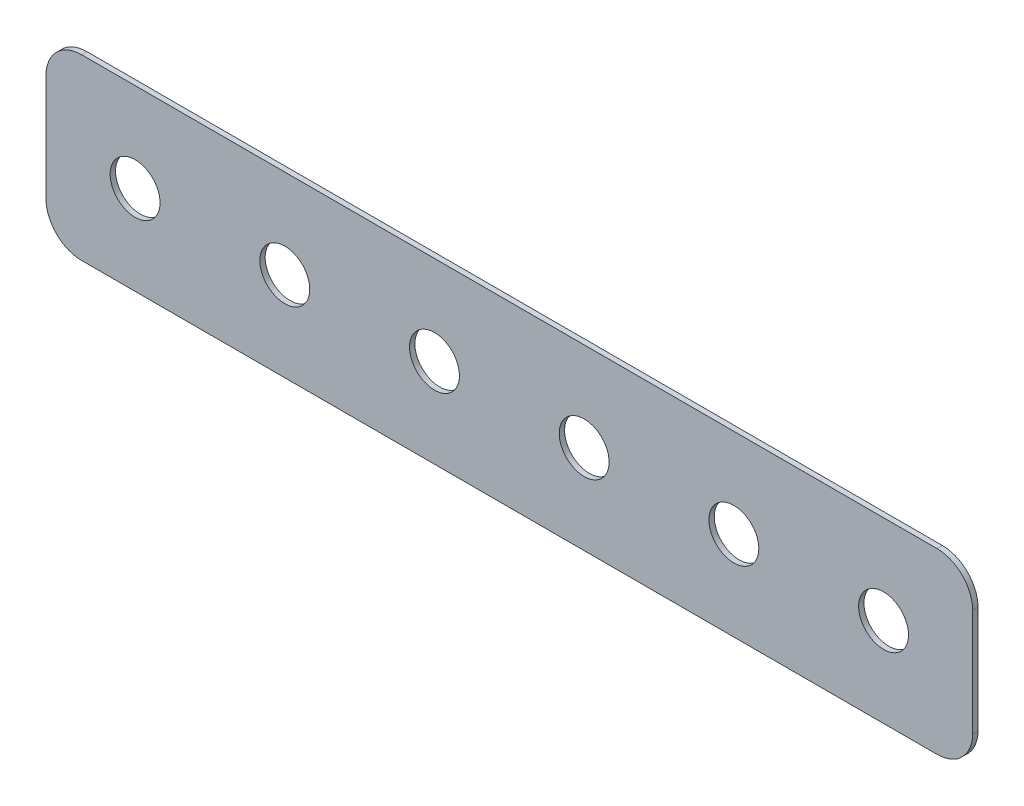
ISO-10303-21;
HEADER;
FILE_DESCRIPTION(('STEP AP214'),'2;1');
FILE_NAME('part.step','',(''),(''),'','','');
FILE_SCHEMA(('AUTOMOTIVE_DESIGN { 1 0 10303 214 1 1 1 1 }'));
ENDSEC;
DATA;
#1=APPLICATION_CONTEXT('core data for automotive mechanical design processes');
#2=APPLICATION_PROTOCOL_DEFINITION('international standard','automotive_design',2000,#1);
#3=PRODUCT_CONTEXT('',#1,'mechanical');
#4=PRODUCT('Part','Part','',(#3));
#5=PRODUCT_RELATED_PRODUCT_CATEGORY('part','',(#4));
#6=PRODUCT_DEFINITION_FORMATION('','',#4);
#7=PRODUCT_DEFINITION_CONTEXT('part definition',#1,'design');
#8=PRODUCT_DEFINITION('design','',#6,#7);
#9=PRODUCT_DEFINITION_SHAPE('','',#8);
#10=(LENGTH_UNIT() NAMED_UNIT(*) SI_UNIT(.MILLI.,.METRE.));
#11=(NAMED_UNIT(*) PLANE_ANGLE_UNIT() SI_UNIT($,.RADIAN.));
#12=(NAMED_UNIT(*) SI_UNIT($,.STERADIAN.) SOLID_ANGLE_UNIT());
#13=UNCERTAINTY_MEASURE_WITH_UNIT(LENGTH_MEASURE(1.E-05),#10,'distance_accuracy_value','');
#14=(GEOMETRIC_REPRESENTATION_CONTEXT(3) GLOBAL_UNCERTAINTY_ASSIGNED_CONTEXT((#13)) GLOBAL_UNIT_ASSIGNED_CONTEXT((#10,
#11,#12)) REPRESENTATION_CONTEXT('',''));
#15=CARTESIAN_POINT('',(0.,0.,0.));
#16=DIRECTION('',(0.,0.,1.));
#17=DIRECTION('',(1.,0.,0.));
#18=AXIS2_PLACEMENT_3D('',#15,#16,#17);
#19=CARTESIAN_POINT('',(1651.,-317.5,19.05));
#20=DIRECTION('',(-1.,0.,0.));
#21=DIRECTION('',(0.,0.,1.));
#22=AXIS2_PLACEMENT_3D('',#19,#20,#21);
#23=PLANE('',#22);
#24=DIRECTION('',(0.,1.,0.));
#25=VECTOR('',#24,1.);
#26=CARTESIAN_POINT('',(1651.,-317.5,19.05));
#27=LINE('',#26,#25);
#28=CARTESIAN_POINT('',(1651.,-190.5,19.05));
#29=VERTEX_POINT('',#28);
#30=CARTESIAN_POINT('',(1651.,190.5,19.05));
#31=VERTEX_POINT('',#30);
#32=EDGE_CURVE('E148',#29,#31,#27,.T.);
#33=ORIENTED_EDGE('',*,*,#32,.F.);
#34=DIRECTION('',(0.,0.,-1.));
#35=VECTOR('',#34,1.);
#36=CARTESIAN_POINT('',(1651.,-190.5,19.05));
#37=LINE('',#36,#35);
#38=CARTESIAN_POINT('',(1651.,-190.5,0.));
#39=VERTEX_POINT('',#38);
#40=EDGE_CURVE('E11',#29,#39,#37,.T.);
#41=ORIENTED_EDGE('',*,*,#40,.T.);
#42=DIRECTION('',(0.,1.,0.));
#43=VECTOR('',#42,1.);
#44=CARTESIAN_POINT('',(1651.,-317.5,0.));
#45=LINE('',#44,#43);
#46=CARTESIAN_POINT('',(1651.,190.5,0.));
#47=VERTEX_POINT('',#46);
#48=EDGE_CURVE('E150',#39,#47,#45,.T.);
#49=ORIENTED_EDGE('',*,*,#48,.T.);
#50=DIRECTION('',(0.,0.,-1.));
#51=VECTOR('',#50,1.);
#52=CARTESIAN_POINT('',(1651.,190.5,19.05));
#53=LINE('',#52,#51);
#54=EDGE_CURVE('E56',#47,#31,#53,.F.);
#55=ORIENTED_EDGE('',*,*,#54,.T.);
#56=EDGE_LOOP('',(#33,#41,#49,#55));
#57=FACE_BOUND('',#56,.T.);
#58=ADVANCED_FACE('F47',(#57),#23,.F.);
#59=CARTESIAN_POINT('',(-1651.,317.5,19.05));
#60=DIRECTION('',(0.,-1.,0.));
#61=DIRECTION('',(0.,0.,-1.));
#62=AXIS2_PLACEMENT_3D('',#59,#60,#61);
#63=PLANE('',#62);
#64=DIRECTION('',(-1.,0.,0.));
#65=VECTOR('',#64,1.);
#66=CARTESIAN_POINT('',(-1651.,317.5,0.));
#67=LINE('',#66,#65);
#68=CARTESIAN_POINT('',(1524.,317.5,0.));
#69=VERTEX_POINT('',#68);
#70=CARTESIAN_POINT('',(-1524.,317.5,0.));
#71=VERTEX_POINT('',#70);
#72=EDGE_CURVE('E144',#69,#71,#67,.T.);
#73=ORIENTED_EDGE('',*,*,#72,.T.);
#74=DIRECTION('',(0.,0.,-1.));
#75=VECTOR('',#74,1.);
#76=CARTESIAN_POINT('',(-1524.,317.5,19.05));
#77=LINE('',#76,#75);
#78=CARTESIAN_POINT('',(-1524.,317.5,19.05));
#79=VERTEX_POINT('',#78);
#80=EDGE_CURVE('E120',#71,#79,#77,.F.);
#81=ORIENTED_EDGE('',*,*,#80,.T.);
#82=DIRECTION('',(-1.,0.,0.));
#83=VECTOR('',#82,1.);
#84=CARTESIAN_POINT('',(-1651.,317.5,19.05));
#85=LINE('',#84,#83);
#86=CARTESIAN_POINT('',(1524.,317.5,19.05));
#87=VERTEX_POINT('',#86);
#88=EDGE_CURVE('E200',#87,#79,#85,.T.);
#89=ORIENTED_EDGE('',*,*,#88,.F.);
#90=DIRECTION('',(0.,0.,-1.));
#91=VECTOR('',#90,1.);
#92=CARTESIAN_POINT('',(1524.,317.5,19.05));
#93=LINE('',#92,#91);
#94=EDGE_CURVE('E126',#87,#69,#93,.T.);
#95=ORIENTED_EDGE('',*,*,#94,.T.);
#96=EDGE_LOOP('',(#73,#81,#89,#95));
#97=FACE_BOUND('',#96,.T.);
#98=ADVANCED_FACE('F204',(#97),#63,.F.);
#99=CARTESIAN_POINT('',(-1651.,-317.5,19.05));
#100=DIRECTION('',(1.,0.,0.));
#101=DIRECTION('',(0.,0.,-1.));
#102=AXIS2_PLACEMENT_3D('',#99,#100,#101);
#103=PLANE('',#102);
#104=DIRECTION('',(0.,-1.,0.));
#105=VECTOR('',#104,1.);
#106=CARTESIAN_POINT('',(-1651.,-317.5,19.05));
#107=LINE('',#106,#105);
#108=CARTESIAN_POINT('',(-1651.,190.5,19.05));
#109=VERTEX_POINT('',#108);
#110=CARTESIAN_POINT('',(-1651.,-190.5,19.05));
#111=VERTEX_POINT('',#110);
#112=EDGE_CURVE('E135',#109,#111,#107,.T.);
#113=ORIENTED_EDGE('',*,*,#112,.F.);
#114=DIRECTION('',(0.,0.,-1.));
#115=VECTOR('',#114,1.);
#116=CARTESIAN_POINT('',(-1651.,190.5,19.05));
#117=LINE('',#116,#115);
#118=CARTESIAN_POINT('',(-1651.,190.5,0.));
#119=VERTEX_POINT('',#118);
#120=EDGE_CURVE('E119',#109,#119,#117,.T.);
#121=ORIENTED_EDGE('',*,*,#120,.T.);
#122=DIRECTION('',(0.,-1.,0.));
#123=VECTOR('',#122,1.);
#124=CARTESIAN_POINT('',(-1651.,-317.5,0.));
#125=LINE('',#124,#123);
#126=CARTESIAN_POINT('',(-1651.,-190.5,0.));
#127=VERTEX_POINT('',#126);
#128=EDGE_CURVE('E133',#119,#127,#125,.T.);
#129=ORIENTED_EDGE('',*,*,#128,.T.);
#130=DIRECTION('',(0.,0.,-1.));
#131=VECTOR('',#130,1.);
#132=CARTESIAN_POINT('',(-1651.,-190.5,19.05));
#133=LINE('',#132,#131);
#134=EDGE_CURVE('E138',#127,#111,#133,.F.);
#135=ORIENTED_EDGE('',*,*,#134,.T.);
#136=EDGE_LOOP('',(#113,#121,#129,#135));
#137=FACE_BOUND('',#136,.T.);
#138=ADVANCED_FACE('F132',(#137),#103,.F.);
#139=CARTESIAN_POINT('',(-1651.,-317.5,19.05));
#140=DIRECTION('',(0.,1.,0.));
#141=DIRECTION('',(0.,0.,1.));
#142=AXIS2_PLACEMENT_3D('',#139,#140,#141);
#143=PLANE('',#142);
#144=DIRECTION('',(1.,0.,0.));
#145=VECTOR('',#144,1.);
#146=CARTESIAN_POINT('',(-1651.,-317.5,19.05));
#147=LINE('',#146,#145);
#148=CARTESIAN_POINT('',(-1524.,-317.5,19.05));
#149=VERTEX_POINT('',#148);
#150=CARTESIAN_POINT('',(1524.,-317.5,19.05));
#151=VERTEX_POINT('',#150);
#152=EDGE_CURVE('E155',#149,#151,#147,.T.);
#153=ORIENTED_EDGE('',*,*,#152,.F.);
#154=DIRECTION('',(0.,0.,-1.));
#155=VECTOR('',#154,1.);
#156=CARTESIAN_POINT('',(-1524.,-317.5,19.05));
#157=LINE('',#156,#155);
#158=CARTESIAN_POINT('',(-1524.,-317.5,0.));
#159=VERTEX_POINT('',#158);
#160=EDGE_CURVE('E182',#149,#159,#157,.T.);
#161=ORIENTED_EDGE('',*,*,#160,.T.);
#162=DIRECTION('',(1.,0.,0.));
#163=VECTOR('',#162,1.);
#164=CARTESIAN_POINT('',(-1651.,-317.5,0.));
#165=LINE('',#164,#163);
#166=CARTESIAN_POINT('',(1524.,-317.5,0.));
#167=VERTEX_POINT('',#166);
#168=EDGE_CURVE('E143',#159,#167,#165,.T.);
#169=ORIENTED_EDGE('',*,*,#168,.T.);
#170=DIRECTION('',(0.,0.,-1.));
#171=VECTOR('',#170,1.);
#172=CARTESIAN_POINT('',(1524.,-317.5,19.05));
#173=LINE('',#172,#171);
#174=EDGE_CURVE('E63',#167,#151,#173,.F.);
#175=ORIENTED_EDGE('',*,*,#174,.T.);
#176=EDGE_LOOP('',(#153,#161,#169,#175));
#177=FACE_BOUND('',#176,.T.);
#178=ADVANCED_FACE('F266',(#177),#143,.F.);
#179=CARTESIAN_POINT('',(0.,0.,19.05));
#180=DIRECTION('',(0.,0.,-1.));
#181=DIRECTION('',(-1.,0.,0.));
#182=AXIS2_PLACEMENT_3D('',#179,#180,#181);
#183=PLANE('',#182);
#184=CARTESIAN_POINT('',(-1333.5,0.,19.05));
#185=DIRECTION('',(0.,0.,1.));
#186=DIRECTION('',(1.,0.,0.));
#187=AXIS2_PLACEMENT_3D('',#184,#185,#186);
#188=CIRCLE('',#187,88.9);
#189=CARTESIAN_POINT('',(-1244.6,0.,19.05));
#190=VERTEX_POINT('',#189);
#191=EDGE_CURVE('E209',#190,#190,#188,.T.);
#192=ORIENTED_EDGE('',*,*,#191,.F.);
#193=EDGE_LOOP('',(#192));
#194=FACE_BOUND('',#193,.T.);
#195=CARTESIAN_POINT('',(-800.1,0.,19.05));
#196=DIRECTION('',(0.,0.,1.));
#197=DIRECTION('',(1.,0.,0.));
#198=AXIS2_PLACEMENT_3D('',#195,#196,#197);
#199=CIRCLE('',#198,88.9);
#200=CARTESIAN_POINT('',(-711.2,0.,19.05));
#201=VERTEX_POINT('',#200);
#202=EDGE_CURVE('E254',#201,#201,#199,.T.);
#203=ORIENTED_EDGE('',*,*,#202,.F.);
#204=EDGE_LOOP('',(#203));
#205=FACE_BOUND('',#204,.T.);
#206=CARTESIAN_POINT('',(-266.7,0.,19.05));
#207=DIRECTION('',(0.,0.,1.));
#208=DIRECTION('',(1.,0.,0.));
#209=AXIS2_PLACEMENT_3D('',#206,#207,#208);
#210=CIRCLE('',#209,88.9);
#211=CARTESIAN_POINT('',(-177.8,0.,19.05));
#212=VERTEX_POINT('',#211);
#213=EDGE_CURVE('E246',#212,#212,#210,.T.);
#214=ORIENTED_EDGE('',*,*,#213,.F.);
#215=EDGE_LOOP('',(#214));
#216=FACE_BOUND('',#215,.T.);
#217=CARTESIAN_POINT('',(266.7,0.,19.05));
#218=DIRECTION('',(0.,0.,1.));
#219=DIRECTION('',(1.,0.,0.));
#220=AXIS2_PLACEMENT_3D('',#217,#218,#219);
#221=CIRCLE('',#220,88.9);
#222=CARTESIAN_POINT('',(355.6,0.,19.05));
#223=VERTEX_POINT('',#222);
#224=EDGE_CURVE('E238',#223,#223,#221,.T.);
#225=ORIENTED_EDGE('',*,*,#224,.F.);
#226=EDGE_LOOP('',(#225));
#227=FACE_BOUND('',#226,.T.);
#228=CARTESIAN_POINT('',(800.1,0.,19.05));
#229=DIRECTION('',(0.,0.,1.));
#230=DIRECTION('',(1.,0.,0.));
#231=AXIS2_PLACEMENT_3D('',#228,#229,#230);
#232=CIRCLE('',#231,88.9);
#233=CARTESIAN_POINT('',(889.,0.,19.05));
#234=VERTEX_POINT('',#233);
#235=EDGE_CURVE('E230',#234,#234,#232,.T.);
#236=ORIENTED_EDGE('',*,*,#235,.F.);
#237=EDGE_LOOP('',(#236));
#238=FACE_BOUND('',#237,.T.);
#239=CARTESIAN_POINT('',(1333.5,0.,19.05));
#240=DIRECTION('',(0.,0.,1.));
#241=DIRECTION('',(1.,0.,0.));
#242=AXIS2_PLACEMENT_3D('',#239,#240,#241);
#243=CIRCLE('',#242,88.9);
#244=CARTESIAN_POINT('',(1422.4,0.,19.05));
#245=VERTEX_POINT('',#244);
#246=EDGE_CURVE('E222',#245,#245,#243,.T.);
#247=ORIENTED_EDGE('',*,*,#246,.F.);
#248=EDGE_LOOP('',(#247));
#249=FACE_BOUND('',#248,.T.);
#250=ORIENTED_EDGE('',*,*,#88,.T.);
#251=CARTESIAN_POINT('',(-1524.,190.5,19.05));
#252=DIRECTION('',(0.,0.,-1.));
#253=DIRECTION('',(-1.,0.,0.));
#254=AXIS2_PLACEMENT_3D('',#251,#252,#253);
#255=CIRCLE('',#254,127.);
#256=EDGE_CURVE('E177',#79,#109,#255,.F.);
#257=ORIENTED_EDGE('',*,*,#256,.T.);
#258=ORIENTED_EDGE('',*,*,#112,.T.);
#259=CARTESIAN_POINT('',(-1524.,-190.5,19.05));
#260=DIRECTION('',(0.,0.,-1.));
#261=DIRECTION('',(-1.,0.,0.));
#262=AXIS2_PLACEMENT_3D('',#259,#260,#261);
#263=CIRCLE('',#262,127.);
#264=EDGE_CURVE('E70',#111,#149,#263,.F.);
#265=ORIENTED_EDGE('',*,*,#264,.T.);
#266=ORIENTED_EDGE('',*,*,#152,.T.);
#267=CARTESIAN_POINT('',(1524.,-190.5,19.05));
#268=DIRECTION('',(0.,0.,-1.));
#269=DIRECTION('',(-1.,0.,0.));
#270=AXIS2_PLACEMENT_3D('',#267,#268,#269);
#271=CIRCLE('',#270,127.);
#272=EDGE_CURVE('E172',#151,#29,#271,.F.);
#273=ORIENTED_EDGE('',*,*,#272,.T.);
#274=ORIENTED_EDGE('',*,*,#32,.T.);
#275=CARTESIAN_POINT('',(1524.,190.5,19.05));
#276=DIRECTION('',(0.,0.,-1.));
#277=DIRECTION('',(-1.,0.,0.));
#278=AXIS2_PLACEMENT_3D('',#275,#276,#277);
#279=CIRCLE('',#278,127.);
#280=EDGE_CURVE('E169',#31,#87,#279,.F.);
#281=ORIENTED_EDGE('',*,*,#280,.T.);
#282=EDGE_LOOP('',(#250,#257,#258,#265,#266,#273,#274,#281));
#283=FACE_BOUND('',#282,.T.);
#284=ADVANCED_FACE('F196',(#194,#205,#216,#227,#238,#249,#283),#183,.F.);
#285=CARTESIAN_POINT('',(0.,0.,0.));
#286=DIRECTION('',(0.,0.,-1.));
#287=DIRECTION('',(-1.,0.,0.));
#288=AXIS2_PLACEMENT_3D('',#285,#286,#287);
#289=PLANE('',#288);
#290=CARTESIAN_POINT('',(-1333.5,0.,0.));
#291=DIRECTION('',(0.,0.,1.));
#292=DIRECTION('',(1.,0.,0.));
#293=AXIS2_PLACEMENT_3D('',#290,#291,#292);
#294=CIRCLE('',#293,88.9);
#295=CARTESIAN_POINT('',(-1244.6,0.,0.));
#296=VERTEX_POINT('',#295);
#297=EDGE_CURVE('E206',#296,#296,#294,.T.);
#298=ORIENTED_EDGE('',*,*,#297,.T.);
#299=EDGE_LOOP('',(#298));
#300=FACE_BOUND('',#299,.T.);
#301=CARTESIAN_POINT('',(-800.1,0.,0.));
#302=DIRECTION('',(0.,0.,1.));
#303=DIRECTION('',(1.,0.,0.));
#304=AXIS2_PLACEMENT_3D('',#301,#302,#303);
#305=CIRCLE('',#304,88.9);
#306=CARTESIAN_POINT('',(-711.2,0.,0.));
#307=VERTEX_POINT('',#306);
#308=EDGE_CURVE('E250',#307,#307,#305,.T.);
#309=ORIENTED_EDGE('',*,*,#308,.T.);
#310=EDGE_LOOP('',(#309));
#311=FACE_BOUND('',#310,.T.);
#312=CARTESIAN_POINT('',(-266.7,0.,0.));
#313=DIRECTION('',(0.,0.,1.));
#314=DIRECTION('',(1.,0.,0.));
#315=AXIS2_PLACEMENT_3D('',#312,#313,#314);
#316=CIRCLE('',#315,88.9);
#317=CARTESIAN_POINT('',(-177.8,0.,0.));
#318=VERTEX_POINT('',#317);
#319=EDGE_CURVE('E242',#318,#318,#316,.T.);
#320=ORIENTED_EDGE('',*,*,#319,.T.);
#321=EDGE_LOOP('',(#320));
#322=FACE_BOUND('',#321,.T.);
#323=CARTESIAN_POINT('',(266.7,0.,0.));
#324=DIRECTION('',(0.,0.,1.));
#325=DIRECTION('',(1.,0.,0.));
#326=AXIS2_PLACEMENT_3D('',#323,#324,#325);
#327=CIRCLE('',#326,88.9);
#328=CARTESIAN_POINT('',(355.6,0.,0.));
#329=VERTEX_POINT('',#328);
#330=EDGE_CURVE('E234',#329,#329,#327,.T.);
#331=ORIENTED_EDGE('',*,*,#330,.T.);
#332=EDGE_LOOP('',(#331));
#333=FACE_BOUND('',#332,.T.);
#334=CARTESIAN_POINT('',(800.1,0.,0.));
#335=DIRECTION('',(0.,0.,1.));
#336=DIRECTION('',(1.,0.,0.));
#337=AXIS2_PLACEMENT_3D('',#334,#335,#336);
#338=CIRCLE('',#337,88.9);
#339=CARTESIAN_POINT('',(889.,0.,0.));
#340=VERTEX_POINT('',#339);
#341=EDGE_CURVE('E226',#340,#340,#338,.T.);
#342=ORIENTED_EDGE('',*,*,#341,.T.);
#343=EDGE_LOOP('',(#342));
#344=FACE_BOUND('',#343,.T.);
#345=CARTESIAN_POINT('',(1333.5,0.,0.));
#346=DIRECTION('',(0.,0.,1.));
#347=DIRECTION('',(1.,0.,0.));
#348=AXIS2_PLACEMENT_3D('',#345,#346,#347);
#349=CIRCLE('',#348,88.9);
#350=CARTESIAN_POINT('',(1422.4,0.,0.));
#351=VERTEX_POINT('',#350);
#352=EDGE_CURVE('E218',#351,#351,#349,.T.);
#353=ORIENTED_EDGE('',*,*,#352,.T.);
#354=EDGE_LOOP('',(#353));
#355=FACE_BOUND('',#354,.T.);
#356=ORIENTED_EDGE('',*,*,#128,.F.);
#357=CARTESIAN_POINT('',(-1524.,190.5,0.));
#358=DIRECTION('',(0.,0.,-1.));
#359=DIRECTION('',(-1.,0.,0.));
#360=AXIS2_PLACEMENT_3D('',#357,#358,#359);
#361=CIRCLE('',#360,127.);
#362=EDGE_CURVE('E115',#119,#71,#361,.T.);
#363=ORIENTED_EDGE('',*,*,#362,.T.);
#364=ORIENTED_EDGE('',*,*,#72,.F.);
#365=CARTESIAN_POINT('',(1524.,190.5,0.));
#366=DIRECTION('',(0.,0.,-1.));
#367=DIRECTION('',(-1.,0.,0.));
#368=AXIS2_PLACEMENT_3D('',#365,#366,#367);
#369=CIRCLE('',#368,127.);
#370=EDGE_CURVE('E137',#69,#47,#369,.T.);
#371=ORIENTED_EDGE('',*,*,#370,.T.);
#372=ORIENTED_EDGE('',*,*,#48,.F.);
#373=CARTESIAN_POINT('',(1524.,-190.5,0.));
#374=DIRECTION('',(0.,0.,-1.));
#375=DIRECTION('',(-1.,0.,0.));
#376=AXIS2_PLACEMENT_3D('',#373,#374,#375);
#377=CIRCLE('',#376,127.);
#378=EDGE_CURVE('E159',#39,#167,#377,.T.);
#379=ORIENTED_EDGE('',*,*,#378,.T.);
#380=ORIENTED_EDGE('',*,*,#168,.F.);
#381=CARTESIAN_POINT('',(-1524.,-190.5,0.));
#382=DIRECTION('',(0.,0.,-1.));
#383=DIRECTION('',(-1.,0.,0.));
#384=AXIS2_PLACEMENT_3D('',#381,#382,#383);
#385=CIRCLE('',#384,127.);
#386=EDGE_CURVE('E127',#159,#127,#385,.T.);
#387=ORIENTED_EDGE('',*,*,#386,.T.);
#388=EDGE_LOOP('',(#356,#363,#364,#371,#372,#379,#380,#387));
#389=FACE_BOUND('',#388,.T.);
#390=ADVANCED_FACE('F140',(#300,#311,#322,#333,#344,#355,#389),#289,.T.);
#391=CARTESIAN_POINT('',(1333.5,0.,0.));
#392=DIRECTION('',(0.,0.,1.));
#393=DIRECTION('',(1.,0.,0.));
#394=AXIS2_PLACEMENT_3D('',#391,#392,#393);
#395=CYLINDRICAL_SURFACE('',#394,88.9);
#396=CARTESIAN_POINT('',(1422.4,0.,0.));
#397=CARTESIAN_POINT('',(1422.4,0.,0.1984375));
#398=CARTESIAN_POINT('',(1422.4,0.,0.396875));
#399=CARTESIAN_POINT('',(1422.4,0.,0.79375));
#400=CARTESIAN_POINT('',(1422.4,0.,0.9921875));
#401=CARTESIAN_POINT('',(1422.4,0.,1.3890625));
#402=CARTESIAN_POINT('',(1422.4,0.,1.5875));
#403=CARTESIAN_POINT('',(1422.4,0.,1.984375));
#404=CARTESIAN_POINT('',(1422.4,0.,2.1828125));
#405=CARTESIAN_POINT('',(1422.4,0.,2.5796875));
#406=CARTESIAN_POINT('',(1422.4,0.,2.778125));
#407=CARTESIAN_POINT('',(1422.4,0.,3.175));
#408=CARTESIAN_POINT('',(1422.4,0.,3.3734375));
#409=CARTESIAN_POINT('',(1422.4,0.,3.7703125));
#410=CARTESIAN_POINT('',(1422.4,0.,3.96875));
#411=CARTESIAN_POINT('',(1422.4,0.,4.365625));
#412=CARTESIAN_POINT('',(1422.4,0.,4.5640625));
#413=CARTESIAN_POINT('',(1422.4,0.,4.9609375));
#414=CARTESIAN_POINT('',(1422.4,0.,5.159375));
#415=CARTESIAN_POINT('',(1422.4,0.,5.55625));
#416=CARTESIAN_POINT('',(1422.4,0.,5.7546875));
#417=CARTESIAN_POINT('',(1422.4,0.,6.1515625));
#418=CARTESIAN_POINT('',(1422.4,0.,6.35));
#419=CARTESIAN_POINT('',(1422.4,0.,6.746875));
#420=CARTESIAN_POINT('',(1422.4,0.,6.9453125));
#421=CARTESIAN_POINT('',(1422.4,0.,7.3421875));
#422=CARTESIAN_POINT('',(1422.4,0.,7.540625));
#423=CARTESIAN_POINT('',(1422.4,0.,7.9375));
#424=CARTESIAN_POINT('',(1422.4,0.,8.1359375));
#425=CARTESIAN_POINT('',(1422.4,0.,8.5328125));
#426=CARTESIAN_POINT('',(1422.4,0.,8.73125));
#427=CARTESIAN_POINT('',(1422.4,0.,9.128125));
#428=CARTESIAN_POINT('',(1422.4,0.,9.3265625));
#429=CARTESIAN_POINT('',(1422.4,0.,9.7234375));
#430=CARTESIAN_POINT('',(1422.4,0.,9.921875));
#431=CARTESIAN_POINT('',(1422.4,0.,10.31875));
#432=CARTESIAN_POINT('',(1422.4,0.,10.5171875));
#433=CARTESIAN_POINT('',(1422.4,0.,10.9140625));
#434=CARTESIAN_POINT('',(1422.4,0.,11.1125));
#435=CARTESIAN_POINT('',(1422.4,0.,11.509375));
#436=CARTESIAN_POINT('',(1422.4,0.,11.7078125));
#437=CARTESIAN_POINT('',(1422.4,0.,12.1046875));
#438=CARTESIAN_POINT('',(1422.4,0.,12.303125));
#439=CARTESIAN_POINT('',(1422.4,0.,12.7));
#440=CARTESIAN_POINT('',(1422.4,0.,12.8984375));
#441=CARTESIAN_POINT('',(1422.4,0.,13.2953125));
#442=CARTESIAN_POINT('',(1422.4,0.,13.49375));
#443=CARTESIAN_POINT('',(1422.4,0.,13.890625));
#444=CARTESIAN_POINT('',(1422.4,0.,14.0890625));
#445=CARTESIAN_POINT('',(1422.4,0.,14.4859375));
#446=CARTESIAN_POINT('',(1422.4,0.,14.684375));
#447=CARTESIAN_POINT('',(1422.4,0.,15.08125));
#448=CARTESIAN_POINT('',(1422.4,0.,15.2796875));
#449=CARTESIAN_POINT('',(1422.4,0.,15.6765625));
#450=CARTESIAN_POINT('',(1422.4,0.,15.875));
#451=CARTESIAN_POINT('',(1422.4,0.,16.271875));
#452=CARTESIAN_POINT('',(1422.4,0.,16.4703125));
#453=CARTESIAN_POINT('',(1422.4,0.,16.8671875));
#454=CARTESIAN_POINT('',(1422.4,0.,17.065625));
#455=CARTESIAN_POINT('',(1422.4,0.,17.4625));
#456=CARTESIAN_POINT('',(1422.4,0.,17.6609375));
#457=CARTESIAN_POINT('',(1422.4,0.,18.0578125));
#458=CARTESIAN_POINT('',(1422.4,0.,18.25625));
#459=CARTESIAN_POINT('',(1422.4,0.,18.653125));
#460=CARTESIAN_POINT('',(1422.4,0.,18.8515625));
#461=CARTESIAN_POINT('',(1422.4,0.,19.05));
#462=B_SPLINE_CURVE_WITH_KNOTS('',3,(#396,#397,#398,#399,#400,#401,#402,#403,#404,#405,#406,
#407,#408,#409,#410,#411,#412,#413,#414,#415,#416,#417,#418,#419,#420,#421,#422,#423,#424,#425,
#426,#427,#428,#429,#430,#431,#432,#433,#434,#435,#436,#437,#438,#439,#440,#441,#442,#443,#444,
#445,#446,#447,#448,#449,#450,#451,#452,#453,#454,#455,#456,#457,#458,#459,#460,#461),
.UNSPECIFIED.,.F.,.F.,(4,2,2,2,2,2,2,2,2,2,2,2,2,2,2,2,2,2,2,2,2,2,2,2,2,2,2,2,2,2,2,2,4),(0.,
0.5953125,1.190625,1.7859375,2.38125,2.9765625,3.571875,4.1671875,4.7625,5.3578125,5.953125,
6.5484375,7.14375,7.7390625,8.334375,8.9296875,9.525,10.1203125,10.715625,11.3109375,11.90625,
12.5015625,13.096875,13.6921875,14.2875,14.8828125,15.478125,16.0734375,16.66875,17.2640625,
17.859375,18.4546875,19.05),.UNSPECIFIED.);
#463=EDGE_CURVE('BSEAM278',#351,#245,#462,.T.);
#464=ORIENTED_EDGE('',*,*,#352,.F.);
#465=ORIENTED_EDGE('',*,*,#246,.T.);
#466=ORIENTED_EDGE('',*,*,#463,.T.);
#467=ORIENTED_EDGE('',*,*,#463,.F.);
#468=EDGE_LOOP('',(#464,#466,#465,#467));
#469=FACE_BOUND('',#468,.T.);
#470=ADVANCED_FACE('F278',(#469),#395,.F.);
#471=CARTESIAN_POINT('',(800.1,0.,0.));
#472=DIRECTION('',(0.,0.,1.));
#473=DIRECTION('',(1.,0.,0.));
#474=AXIS2_PLACEMENT_3D('',#471,#472,#473);
#475=CYLINDRICAL_SURFACE('',#474,88.9);
#476=CARTESIAN_POINT('',(889.,0.,0.));
#477=CARTESIAN_POINT('',(889.,0.,0.1984375));
#478=CARTESIAN_POINT('',(889.,0.,0.396875));
#479=CARTESIAN_POINT('',(889.,0.,0.79375));
#480=CARTESIAN_POINT('',(889.,0.,0.9921875));
#481=CARTESIAN_POINT('',(889.,0.,1.3890625));
#482=CARTESIAN_POINT('',(889.,0.,1.5875));
#483=CARTESIAN_POINT('',(889.,0.,1.984375));
#484=CARTESIAN_POINT('',(889.,0.,2.1828125));
#485=CARTESIAN_POINT('',(889.,0.,2.5796875));
#486=CARTESIAN_POINT('',(889.,0.,2.778125));
#487=CARTESIAN_POINT('',(889.,0.,3.175));
#488=CARTESIAN_POINT('',(889.,0.,3.3734375));
#489=CARTESIAN_POINT('',(889.,0.,3.7703125));
#490=CARTESIAN_POINT('',(889.,0.,3.96875));
#491=CARTESIAN_POINT('',(889.,0.,4.365625));
#492=CARTESIAN_POINT('',(889.,0.,4.5640625));
#493=CARTESIAN_POINT('',(889.,0.,4.9609375));
#494=CARTESIAN_POINT('',(889.,0.,5.159375));
#495=CARTESIAN_POINT('',(889.,0.,5.55625));
#496=CARTESIAN_POINT('',(889.,0.,5.7546875));
#497=CARTESIAN_POINT('',(889.,0.,6.1515625));
#498=CARTESIAN_POINT('',(889.,0.,6.35));
#499=CARTESIAN_POINT('',(889.,0.,6.746875));
#500=CARTESIAN_POINT('',(889.,0.,6.9453125));
#501=CARTESIAN_POINT('',(889.,0.,7.3421875));
#502=CARTESIAN_POINT('',(889.,0.,7.540625));
#503=CARTESIAN_POINT('',(889.,0.,7.9375));
#504=CARTESIAN_POINT('',(889.,0.,8.1359375));
#505=CARTESIAN_POINT('',(889.,0.,8.5328125));
#506=CARTESIAN_POINT('',(889.,0.,8.73125));
#507=CARTESIAN_POINT('',(889.,0.,9.128125));
#508=CARTESIAN_POINT('',(889.,0.,9.3265625));
#509=CARTESIAN_POINT('',(889.,0.,9.7234375));
#510=CARTESIAN_POINT('',(889.,0.,9.921875));
#511=CARTESIAN_POINT('',(889.,0.,10.31875));
#512=CARTESIAN_POINT('',(889.,0.,10.5171875));
#513=CARTESIAN_POINT('',(889.,0.,10.9140625));
#514=CARTESIAN_POINT('',(889.,0.,11.1125));
#515=CARTESIAN_POINT('',(889.,0.,11.509375));
#516=CARTESIAN_POINT('',(889.,0.,11.7078125));
#517=CARTESIAN_POINT('',(889.,0.,12.1046875));
#518=CARTESIAN_POINT('',(889.,0.,12.303125));
#519=CARTESIAN_POINT('',(889.,0.,12.7));
#520=CARTESIAN_POINT('',(889.,0.,12.8984375));
#521=CARTESIAN_POINT('',(889.,0.,13.2953125));
#522=CARTESIAN_POINT('',(889.,0.,13.49375));
#523=CARTESIAN_POINT('',(889.,0.,13.890625));
#524=CARTESIAN_POINT('',(889.,0.,14.0890625));
#525=CARTESIAN_POINT('',(889.,0.,14.4859375));
#526=CARTESIAN_POINT('',(889.,0.,14.684375));
#527=CARTESIAN_POINT('',(889.,0.,15.08125));
#528=CARTESIAN_POINT('',(889.,0.,15.2796875));
#529=CARTESIAN_POINT('',(889.,0.,15.6765625));
#530=CARTESIAN_POINT('',(889.,0.,15.875));
#531=CARTESIAN_POINT('',(889.,0.,16.271875));
#532=CARTESIAN_POINT('',(889.,0.,16.4703125));
#533=CARTESIAN_POINT('',(889.,0.,16.8671875));
#534=CARTESIAN_POINT('',(889.,0.,17.065625));
#535=CARTESIAN_POINT('',(889.,0.,17.4625));
#536=CARTESIAN_POINT('',(889.,0.,17.6609375));
#537=CARTESIAN_POINT('',(889.,0.,18.0578125));
#538=CARTESIAN_POINT('',(889.,0.,18.25625));
#539=CARTESIAN_POINT('',(889.,0.,18.653125));
#540=CARTESIAN_POINT('',(889.,0.,18.8515625));
#541=CARTESIAN_POINT('',(889.,0.,19.05));
#542=B_SPLINE_CURVE_WITH_KNOTS('',3,(#476,#477,#478,#479,#480,#481,#482,#483,#484,#485,#486,
#487,#488,#489,#490,#491,#492,#493,#494,#495,#496,#497,#498,#499,#500,#501,#502,#503,#504,#505,
#506,#507,#508,#509,#510,#511,#512,#513,#514,#515,#516,#517,#518,#519,#520,#521,#522,#523,#524,
#525,#526,#527,#528,#529,#530,#531,#532,#533,#534,#535,#536,#537,#538,#539,#540,#541),
.UNSPECIFIED.,.F.,.F.,(4,2,2,2,2,2,2,2,2,2,2,2,2,2,2,2,2,2,2,2,2,2,2,2,2,2,2,2,2,2,2,2,4),(0.,
0.5953125,1.190625,1.7859375,2.38125,2.9765625,3.571875,4.1671875,4.7625,5.3578125,5.953125,
6.5484375,7.14375,7.7390625,8.334375,8.9296875,9.525,10.1203125,10.715625,11.3109375,11.90625,
12.5015625,13.096875,13.6921875,14.2875,14.8828125,15.478125,16.0734375,16.66875,17.2640625,
17.859375,18.4546875,19.05),.UNSPECIFIED.);
#543=EDGE_CURVE('BSEAM280',#340,#234,#542,.T.);
#544=ORIENTED_EDGE('',*,*,#341,.F.);
#545=ORIENTED_EDGE('',*,*,#235,.T.);
#546=ORIENTED_EDGE('',*,*,#543,.T.);
#547=ORIENTED_EDGE('',*,*,#543,.F.);
#548=EDGE_LOOP('',(#544,#546,#545,#547));
#549=FACE_BOUND('',#548,.T.);
#550=ADVANCED_FACE('F280',(#549),#475,.F.);
#551=CARTESIAN_POINT('',(266.7,0.,0.));
#552=DIRECTION('',(0.,0.,1.));
#553=DIRECTION('',(1.,0.,0.));
#554=AXIS2_PLACEMENT_3D('',#551,#552,#553);
#555=CYLINDRICAL_SURFACE('',#554,88.9);
#556=CARTESIAN_POINT('',(355.6,0.,0.));
#557=CARTESIAN_POINT('',(355.6,0.,0.1984375));
#558=CARTESIAN_POINT('',(355.6,0.,0.396875));
#559=CARTESIAN_POINT('',(355.6,0.,0.79375));
#560=CARTESIAN_POINT('',(355.6,0.,0.9921875));
#561=CARTESIAN_POINT('',(355.6,0.,1.3890625));
#562=CARTESIAN_POINT('',(355.6,0.,1.5875));
#563=CARTESIAN_POINT('',(355.6,0.,1.984375));
#564=CARTESIAN_POINT('',(355.6,0.,2.1828125));
#565=CARTESIAN_POINT('',(355.6,0.,2.5796875));
#566=CARTESIAN_POINT('',(355.6,0.,2.778125));
#567=CARTESIAN_POINT('',(355.6,0.,3.175));
#568=CARTESIAN_POINT('',(355.6,0.,3.3734375));
#569=CARTESIAN_POINT('',(355.6,0.,3.7703125));
#570=CARTESIAN_POINT('',(355.6,0.,3.96875));
#571=CARTESIAN_POINT('',(355.6,0.,4.365625));
#572=CARTESIAN_POINT('',(355.6,0.,4.5640625));
#573=CARTESIAN_POINT('',(355.6,0.,4.9609375));
#574=CARTESIAN_POINT('',(355.6,0.,5.159375));
#575=CARTESIAN_POINT('',(355.6,0.,5.55625));
#576=CARTESIAN_POINT('',(355.6,0.,5.7546875));
#577=CARTESIAN_POINT('',(355.6,0.,6.1515625));
#578=CARTESIAN_POINT('',(355.6,0.,6.35));
#579=CARTESIAN_POINT('',(355.6,0.,6.746875));
#580=CARTESIAN_POINT('',(355.6,0.,6.9453125));
#581=CARTESIAN_POINT('',(355.6,0.,7.3421875));
#582=CARTESIAN_POINT('',(355.6,0.,7.540625));
#583=CARTESIAN_POINT('',(355.6,0.,7.9375));
#584=CARTESIAN_POINT('',(355.6,0.,8.1359375));
#585=CARTESIAN_POINT('',(355.6,0.,8.5328125));
#586=CARTESIAN_POINT('',(355.6,0.,8.73125));
#587=CARTESIAN_POINT('',(355.6,0.,9.128125));
#588=CARTESIAN_POINT('',(355.6,0.,9.3265625));
#589=CARTESIAN_POINT('',(355.6,0.,9.7234375));
#590=CARTESIAN_POINT('',(355.6,0.,9.921875));
#591=CARTESIAN_POINT('',(355.6,0.,10.31875));
#592=CARTESIAN_POINT('',(355.6,0.,10.5171875));
#593=CARTESIAN_POINT('',(355.6,0.,10.9140625));
#594=CARTESIAN_POINT('',(355.6,0.,11.1125));
#595=CARTESIAN_POINT('',(355.6,0.,11.509375));
#596=CARTESIAN_POINT('',(355.6,0.,11.7078125));
#597=CARTESIAN_POINT('',(355.6,0.,12.1046875));
#598=CARTESIAN_POINT('',(355.6,0.,12.303125));
#599=CARTESIAN_POINT('',(355.6,0.,12.7));
#600=CARTESIAN_POINT('',(355.6,0.,12.8984375));
#601=CARTESIAN_POINT('',(355.6,0.,13.2953125));
#602=CARTESIAN_POINT('',(355.6,0.,13.49375));
#603=CARTESIAN_POINT('',(355.6,0.,13.890625));
#604=CARTESIAN_POINT('',(355.6,0.,14.0890625));
#605=CARTESIAN_POINT('',(355.6,0.,14.4859375));
#606=CARTESIAN_POINT('',(355.6,0.,14.684375));
#607=CARTESIAN_POINT('',(355.6,0.,15.08125));
#608=CARTESIAN_POINT('',(355.6,0.,15.2796875));
#609=CARTESIAN_POINT('',(355.6,0.,15.6765625));
#610=CARTESIAN_POINT('',(355.6,0.,15.875));
#611=CARTESIAN_POINT('',(355.6,0.,16.271875));
#612=CARTESIAN_POINT('',(355.6,0.,16.4703125));
#613=CARTESIAN_POINT('',(355.6,0.,16.8671875));
#614=CARTESIAN_POINT('',(355.6,0.,17.065625));
#615=CARTESIAN_POINT('',(355.6,0.,17.4625));
#616=CARTESIAN_POINT('',(355.6,0.,17.6609375));
#617=CARTESIAN_POINT('',(355.6,0.,18.0578125));
#618=CARTESIAN_POINT('',(355.6,0.,18.25625));
#619=CARTESIAN_POINT('',(355.6,0.,18.653125));
#620=CARTESIAN_POINT('',(355.6,0.,18.8515625));
#621=CARTESIAN_POINT('',(355.6,0.,19.05));
#622=B_SPLINE_CURVE_WITH_KNOTS('',3,(#556,#557,#558,#559,#560,#561,#562,#563,#564,#565,#566,
#567,#568,#569,#570,#571,#572,#573,#574,#575,#576,#577,#578,#579,#580,#581,#582,#583,#584,#585,
#586,#587,#588,#589,#590,#591,#592,#593,#594,#595,#596,#597,#598,#599,#600,#601,#602,#603,#604,
#605,#606,#607,#608,#609,#610,#611,#612,#613,#614,#615,#616,#617,#618,#619,#620,#621),
.UNSPECIFIED.,.F.,.F.,(4,2,2,2,2,2,2,2,2,2,2,2,2,2,2,2,2,2,2,2,2,2,2,2,2,2,2,2,2,2,2,2,4),(0.,
0.5953125,1.190625,1.7859375,2.38125,2.9765625,3.571875,4.1671875,4.7625,5.3578125,5.953125,
6.5484375,7.14375,7.7390625,8.334375,8.9296875,9.525,10.1203125,10.715625,11.3109375,11.90625,
12.5015625,13.096875,13.6921875,14.2875,14.8828125,15.478125,16.0734375,16.66875,17.2640625,
17.859375,18.4546875,19.05),.UNSPECIFIED.);
#623=EDGE_CURVE('BSEAM286',#329,#223,#622,.T.);
#624=ORIENTED_EDGE('',*,*,#330,.F.);
#625=ORIENTED_EDGE('',*,*,#224,.T.);
#626=ORIENTED_EDGE('',*,*,#623,.T.);
#627=ORIENTED_EDGE('',*,*,#623,.F.);
#628=EDGE_LOOP('',(#624,#626,#625,#627));
#629=FACE_BOUND('',#628,.T.);
#630=ADVANCED_FACE('F286',(#629),#555,.F.);
#631=CARTESIAN_POINT('',(-266.7,0.,0.));
#632=DIRECTION('',(0.,0.,1.));
#633=DIRECTION('',(1.,0.,0.));
#634=AXIS2_PLACEMENT_3D('',#631,#632,#633);
#635=CYLINDRICAL_SURFACE('',#634,88.9);
#636=CARTESIAN_POINT('',(-177.8,0.,0.));
#637=CARTESIAN_POINT('',(-177.8,0.,0.1984375));
#638=CARTESIAN_POINT('',(-177.8,0.,0.396875));
#639=CARTESIAN_POINT('',(-177.8,0.,0.79375));
#640=CARTESIAN_POINT('',(-177.8,0.,0.9921875));
#641=CARTESIAN_POINT('',(-177.8,0.,1.3890625));
#642=CARTESIAN_POINT('',(-177.8,0.,1.5875));
#643=CARTESIAN_POINT('',(-177.8,0.,1.984375));
#644=CARTESIAN_POINT('',(-177.8,0.,2.1828125));
#645=CARTESIAN_POINT('',(-177.8,0.,2.5796875));
#646=CARTESIAN_POINT('',(-177.8,0.,2.778125));
#647=CARTESIAN_POINT('',(-177.8,0.,3.175));
#648=CARTESIAN_POINT('',(-177.8,0.,3.3734375));
#649=CARTESIAN_POINT('',(-177.8,0.,3.7703125));
#650=CARTESIAN_POINT('',(-177.8,0.,3.96875));
#651=CARTESIAN_POINT('',(-177.8,0.,4.365625));
#652=CARTESIAN_POINT('',(-177.8,0.,4.5640625));
#653=CARTESIAN_POINT('',(-177.8,0.,4.9609375));
#654=CARTESIAN_POINT('',(-177.8,0.,5.159375));
#655=CARTESIAN_POINT('',(-177.8,0.,5.55625));
#656=CARTESIAN_POINT('',(-177.8,0.,5.7546875));
#657=CARTESIAN_POINT('',(-177.8,0.,6.1515625));
#658=CARTESIAN_POINT('',(-177.8,0.,6.35));
#659=CARTESIAN_POINT('',(-177.8,0.,6.746875));
#660=CARTESIAN_POINT('',(-177.8,0.,6.9453125));
#661=CARTESIAN_POINT('',(-177.8,0.,7.3421875));
#662=CARTESIAN_POINT('',(-177.8,0.,7.540625));
#663=CARTESIAN_POINT('',(-177.8,0.,7.9375));
#664=CARTESIAN_POINT('',(-177.8,0.,8.1359375));
#665=CARTESIAN_POINT('',(-177.8,0.,8.5328125));
#666=CARTESIAN_POINT('',(-177.8,0.,8.73125));
#667=CARTESIAN_POINT('',(-177.8,0.,9.128125));
#668=CARTESIAN_POINT('',(-177.8,0.,9.3265625));
#669=CARTESIAN_POINT('',(-177.8,0.,9.7234375));
#670=CARTESIAN_POINT('',(-177.8,0.,9.921875));
#671=CARTESIAN_POINT('',(-177.8,0.,10.31875));
#672=CARTESIAN_POINT('',(-177.8,0.,10.5171875));
#673=CARTESIAN_POINT('',(-177.8,0.,10.9140625));
#674=CARTESIAN_POINT('',(-177.8,0.,11.1125));
#675=CARTESIAN_POINT('',(-177.8,0.,11.509375));
#676=CARTESIAN_POINT('',(-177.8,0.,11.7078125));
#677=CARTESIAN_POINT('',(-177.8,0.,12.1046875));
#678=CARTESIAN_POINT('',(-177.8,0.,12.303125));
#679=CARTESIAN_POINT('',(-177.8,0.,12.7));
#680=CARTESIAN_POINT('',(-177.8,0.,12.8984375));
#681=CARTESIAN_POINT('',(-177.8,0.,13.2953125));
#682=CARTESIAN_POINT('',(-177.8,0.,13.49375));
#683=CARTESIAN_POINT('',(-177.8,0.,13.890625));
#684=CARTESIAN_POINT('',(-177.8,0.,14.0890625));
#685=CARTESIAN_POINT('',(-177.8,0.,14.4859375));
#686=CARTESIAN_POINT('',(-177.8,0.,14.684375));
#687=CARTESIAN_POINT('',(-177.8,0.,15.08125));
#688=CARTESIAN_POINT('',(-177.8,0.,15.2796875));
#689=CARTESIAN_POINT('',(-177.8,0.,15.6765625));
#690=CARTESIAN_POINT('',(-177.8,0.,15.875));
#691=CARTESIAN_POINT('',(-177.8,0.,16.271875));
#692=CARTESIAN_POINT('',(-177.8,0.,16.4703125));
#693=CARTESIAN_POINT('',(-177.8,0.,16.8671875));
#694=CARTESIAN_POINT('',(-177.8,0.,17.065625));
#695=CARTESIAN_POINT('',(-177.8,0.,17.4625));
#696=CARTESIAN_POINT('',(-177.8,0.,17.6609375));
#697=CARTESIAN_POINT('',(-177.8,0.,18.0578125));
#698=CARTESIAN_POINT('',(-177.8,0.,18.25625));
#699=CARTESIAN_POINT('',(-177.8,0.,18.653125));
#700=CARTESIAN_POINT('',(-177.8,0.,18.8515625));
#701=CARTESIAN_POINT('',(-177.8,0.,19.05));
#702=B_SPLINE_CURVE_WITH_KNOTS('',3,(#636,#637,#638,#639,#640,#641,#642,#643,#644,#645,#646,
#647,#648,#649,#650,#651,#652,#653,#654,#655,#656,#657,#658,#659,#660,#661,#662,#663,#664,#665,
#666,#667,#668,#669,#670,#671,#672,#673,#674,#675,#676,#677,#678,#679,#680,#681,#682,#683,#684,
#685,#686,#687,#688,#689,#690,#691,#692,#693,#694,#695,#696,#697,#698,#699,#700,#701),
.UNSPECIFIED.,.F.,.F.,(4,2,2,2,2,2,2,2,2,2,2,2,2,2,2,2,2,2,2,2,2,2,2,2,2,2,2,2,2,2,2,2,4),(0.,
0.5953125,1.190625,1.7859375,2.38125,2.9765625,3.571875,4.1671875,4.7625,5.3578125,5.953125,
6.5484375,7.14375,7.7390625,8.334375,8.9296875,9.525,10.1203125,10.715625,11.3109375,11.90625,
12.5015625,13.096875,13.6921875,14.2875,14.8828125,15.478125,16.0734375,16.66875,17.2640625,
17.859375,18.4546875,19.05),.UNSPECIFIED.);
#703=EDGE_CURVE('BSEAM350',#318,#212,#702,.T.);
#704=ORIENTED_EDGE('',*,*,#319,.F.);
#705=ORIENTED_EDGE('',*,*,#213,.T.);
#706=ORIENTED_EDGE('',*,*,#703,.T.);
#707=ORIENTED_EDGE('',*,*,#703,.F.);
#708=EDGE_LOOP('',(#704,#706,#705,#707));
#709=FACE_BOUND('',#708,.T.);
#710=ADVANCED_FACE('F350',(#709),#635,.F.);
#711=CARTESIAN_POINT('',(-800.1,0.,0.));
#712=DIRECTION('',(0.,0.,1.));
#713=DIRECTION('',(1.,0.,0.));
#714=AXIS2_PLACEMENT_3D('',#711,#712,#713);
#715=CYLINDRICAL_SURFACE('',#714,88.9);
#716=CARTESIAN_POINT('',(-711.2,0.,0.));
#717=CARTESIAN_POINT('',(-711.2,0.,0.1984375));
#718=CARTESIAN_POINT('',(-711.2,0.,0.396875));
#719=CARTESIAN_POINT('',(-711.2,0.,0.79375));
#720=CARTESIAN_POINT('',(-711.2,0.,0.9921875));
#721=CARTESIAN_POINT('',(-711.2,0.,1.3890625));
#722=CARTESIAN_POINT('',(-711.2,0.,1.5875));
#723=CARTESIAN_POINT('',(-711.2,0.,1.984375));
#724=CARTESIAN_POINT('',(-711.2,0.,2.1828125));
#725=CARTESIAN_POINT('',(-711.2,0.,2.5796875));
#726=CARTESIAN_POINT('',(-711.2,0.,2.778125));
#727=CARTESIAN_POINT('',(-711.2,0.,3.175));
#728=CARTESIAN_POINT('',(-711.2,0.,3.3734375));
#729=CARTESIAN_POINT('',(-711.2,0.,3.7703125));
#730=CARTESIAN_POINT('',(-711.2,0.,3.96875));
#731=CARTESIAN_POINT('',(-711.2,0.,4.365625));
#732=CARTESIAN_POINT('',(-711.2,0.,4.5640625));
#733=CARTESIAN_POINT('',(-711.2,0.,4.9609375));
#734=CARTESIAN_POINT('',(-711.2,0.,5.159375));
#735=CARTESIAN_POINT('',(-711.2,0.,5.55625));
#736=CARTESIAN_POINT('',(-711.2,0.,5.7546875));
#737=CARTESIAN_POINT('',(-711.2,0.,6.1515625));
#738=CARTESIAN_POINT('',(-711.2,0.,6.35));
#739=CARTESIAN_POINT('',(-711.2,0.,6.746875));
#740=CARTESIAN_POINT('',(-711.2,0.,6.9453125));
#741=CARTESIAN_POINT('',(-711.2,0.,7.3421875));
#742=CARTESIAN_POINT('',(-711.2,0.,7.540625));
#743=CARTESIAN_POINT('',(-711.2,0.,7.9375));
#744=CARTESIAN_POINT('',(-711.2,0.,8.1359375));
#745=CARTESIAN_POINT('',(-711.2,0.,8.5328125));
#746=CARTESIAN_POINT('',(-711.2,0.,8.73125));
#747=CARTESIAN_POINT('',(-711.2,0.,9.128125));
#748=CARTESIAN_POINT('',(-711.2,0.,9.3265625));
#749=CARTESIAN_POINT('',(-711.2,0.,9.7234375));
#750=CARTESIAN_POINT('',(-711.2,0.,9.921875));
#751=CARTESIAN_POINT('',(-711.2,0.,10.31875));
#752=CARTESIAN_POINT('',(-711.2,0.,10.5171875));
#753=CARTESIAN_POINT('',(-711.2,0.,10.9140625));
#754=CARTESIAN_POINT('',(-711.2,0.,11.1125));
#755=CARTESIAN_POINT('',(-711.2,0.,11.509375));
#756=CARTESIAN_POINT('',(-711.2,0.,11.7078125));
#757=CARTESIAN_POINT('',(-711.2,0.,12.1046875));
#758=CARTESIAN_POINT('',(-711.2,0.,12.303125));
#759=CARTESIAN_POINT('',(-711.2,0.,12.7));
#760=CARTESIAN_POINT('',(-711.2,0.,12.8984375));
#761=CARTESIAN_POINT('',(-711.2,0.,13.2953125));
#762=CARTESIAN_POINT('',(-711.2,0.,13.49375));
#763=CARTESIAN_POINT('',(-711.2,0.,13.890625));
#764=CARTESIAN_POINT('',(-711.2,0.,14.0890625));
#765=CARTESIAN_POINT('',(-711.2,0.,14.4859375));
#766=CARTESIAN_POINT('',(-711.2,0.,14.684375));
#767=CARTESIAN_POINT('',(-711.2,0.,15.08125));
#768=CARTESIAN_POINT('',(-711.2,0.,15.2796875));
#769=CARTESIAN_POINT('',(-711.2,0.,15.6765625));
#770=CARTESIAN_POINT('',(-711.2,0.,15.875));
#771=CARTESIAN_POINT('',(-711.2,0.,16.271875));
#772=CARTESIAN_POINT('',(-711.2,0.,16.4703125));
#773=CARTESIAN_POINT('',(-711.2,0.,16.8671875));
#774=CARTESIAN_POINT('',(-711.2,0.,17.065625));
#775=CARTESIAN_POINT('',(-711.2,0.,17.4625));
#776=CARTESIAN_POINT('',(-711.2,0.,17.6609375));
#777=CARTESIAN_POINT('',(-711.2,0.,18.0578125));
#778=CARTESIAN_POINT('',(-711.2,0.,18.25625));
#779=CARTESIAN_POINT('',(-711.2,0.,18.653125));
#780=CARTESIAN_POINT('',(-711.2,0.,18.8515625));
#781=CARTESIAN_POINT('',(-711.2,0.,19.05));
#782=B_SPLINE_CURVE_WITH_KNOTS('',3,(#716,#717,#718,#719,#720,#721,#722,#723,#724,#725,#726,
#727,#728,#729,#730,#731,#732,#733,#734,#735,#736,#737,#738,#739,#740,#741,#742,#743,#744,#745,
#746,#747,#748,#749,#750,#751,#752,#753,#754,#755,#756,#757,#758,#759,#760,#761,#762,#763,#764,
#765,#766,#767,#768,#769,#770,#771,#772,#773,#774,#775,#776,#777,#778,#779,#780,#781),
.UNSPECIFIED.,.F.,.F.,(4,2,2,2,2,2,2,2,2,2,2,2,2,2,2,2,2,2,2,2,2,2,2,2,2,2,2,2,2,2,2,2,4),(0.,
0.5953125,1.190625,1.7859375,2.38125,2.9765625,3.571875,4.1671875,4.7625,5.3578125,5.953125,
6.5484375,7.14375,7.7390625,8.334375,8.9296875,9.525,10.1203125,10.715625,11.3109375,11.90625,
12.5015625,13.096875,13.6921875,14.2875,14.8828125,15.478125,16.0734375,16.66875,17.2640625,
17.859375,18.4546875,19.05),.UNSPECIFIED.);
#783=EDGE_CURVE('BSEAM340',#307,#201,#782,.T.);
#784=ORIENTED_EDGE('',*,*,#308,.F.);
#785=ORIENTED_EDGE('',*,*,#202,.T.);
#786=ORIENTED_EDGE('',*,*,#783,.T.);
#787=ORIENTED_EDGE('',*,*,#783,.F.);
#788=EDGE_LOOP('',(#784,#786,#785,#787));
#789=FACE_BOUND('',#788,.T.);
#790=ADVANCED_FACE('F340',(#789),#715,.F.);
#791=CARTESIAN_POINT('',(-1333.5,0.,0.));
#792=DIRECTION('',(0.,0.,1.));
#793=DIRECTION('',(1.,0.,0.));
#794=AXIS2_PLACEMENT_3D('',#791,#792,#793);
#795=CYLINDRICAL_SURFACE('',#794,88.9);
#796=CARTESIAN_POINT('',(-1244.6,0.,0.));
#797=CARTESIAN_POINT('',(-1244.6,0.,0.1984375));
#798=CARTESIAN_POINT('',(-1244.6,0.,0.396875));
#799=CARTESIAN_POINT('',(-1244.6,0.,0.79375));
#800=CARTESIAN_POINT('',(-1244.6,0.,0.9921875));
#801=CARTESIAN_POINT('',(-1244.6,0.,1.3890625));
#802=CARTESIAN_POINT('',(-1244.6,0.,1.5875));
#803=CARTESIAN_POINT('',(-1244.6,0.,1.984375));
#804=CARTESIAN_POINT('',(-1244.6,0.,2.1828125));
#805=CARTESIAN_POINT('',(-1244.6,0.,2.5796875));
#806=CARTESIAN_POINT('',(-1244.6,0.,2.778125));
#807=CARTESIAN_POINT('',(-1244.6,0.,3.175));
#808=CARTESIAN_POINT('',(-1244.6,0.,3.3734375));
#809=CARTESIAN_POINT('',(-1244.6,0.,3.7703125));
#810=CARTESIAN_POINT('',(-1244.6,0.,3.96875));
#811=CARTESIAN_POINT('',(-1244.6,0.,4.365625));
#812=CARTESIAN_POINT('',(-1244.6,0.,4.5640625));
#813=CARTESIAN_POINT('',(-1244.6,0.,4.9609375));
#814=CARTESIAN_POINT('',(-1244.6,0.,5.159375));
#815=CARTESIAN_POINT('',(-1244.6,0.,5.55625));
#816=CARTESIAN_POINT('',(-1244.6,0.,5.7546875));
#817=CARTESIAN_POINT('',(-1244.6,0.,6.1515625));
#818=CARTESIAN_POINT('',(-1244.6,0.,6.35));
#819=CARTESIAN_POINT('',(-1244.6,0.,6.746875));
#820=CARTESIAN_POINT('',(-1244.6,0.,6.9453125));
#821=CARTESIAN_POINT('',(-1244.6,0.,7.3421875));
#822=CARTESIAN_POINT('',(-1244.6,0.,7.540625));
#823=CARTESIAN_POINT('',(-1244.6,0.,7.9375));
#824=CARTESIAN_POINT('',(-1244.6,0.,8.1359375));
#825=CARTESIAN_POINT('',(-1244.6,0.,8.5328125));
#826=CARTESIAN_POINT('',(-1244.6,0.,8.73125));
#827=CARTESIAN_POINT('',(-1244.6,0.,9.128125));
#828=CARTESIAN_POINT('',(-1244.6,0.,9.3265625));
#829=CARTESIAN_POINT('',(-1244.6,0.,9.7234375));
#830=CARTESIAN_POINT('',(-1244.6,0.,9.921875));
#831=CARTESIAN_POINT('',(-1244.6,0.,10.31875));
#832=CARTESIAN_POINT('',(-1244.6,0.,10.5171875));
#833=CARTESIAN_POINT('',(-1244.6,0.,10.9140625));
#834=CARTESIAN_POINT('',(-1244.6,0.,11.1125));
#835=CARTESIAN_POINT('',(-1244.6,0.,11.509375));
#836=CARTESIAN_POINT('',(-1244.6,0.,11.7078125));
#837=CARTESIAN_POINT('',(-1244.6,0.,12.1046875));
#838=CARTESIAN_POINT('',(-1244.6,0.,12.303125));
#839=CARTESIAN_POINT('',(-1244.6,0.,12.7));
#840=CARTESIAN_POINT('',(-1244.6,0.,12.8984375));
#841=CARTESIAN_POINT('',(-1244.6,0.,13.2953125));
#842=CARTESIAN_POINT('',(-1244.6,0.,13.49375));
#843=CARTESIAN_POINT('',(-1244.6,0.,13.890625));
#844=CARTESIAN_POINT('',(-1244.6,0.,14.0890625));
#845=CARTESIAN_POINT('',(-1244.6,0.,14.4859375));
#846=CARTESIAN_POINT('',(-1244.6,0.,14.684375));
#847=CARTESIAN_POINT('',(-1244.6,0.,15.08125));
#848=CARTESIAN_POINT('',(-1244.6,0.,15.2796875));
#849=CARTESIAN_POINT('',(-1244.6,0.,15.6765625));
#850=CARTESIAN_POINT('',(-1244.6,0.,15.875));
#851=CARTESIAN_POINT('',(-1244.6,0.,16.271875));
#852=CARTESIAN_POINT('',(-1244.6,0.,16.4703125));
#853=CARTESIAN_POINT('',(-1244.6,0.,16.8671875));
#854=CARTESIAN_POINT('',(-1244.6,0.,17.065625));
#855=CARTESIAN_POINT('',(-1244.6,0.,17.4625));
#856=CARTESIAN_POINT('',(-1244.6,0.,17.6609375));
#857=CARTESIAN_POINT('',(-1244.6,0.,18.0578125));
#858=CARTESIAN_POINT('',(-1244.6,0.,18.25625));
#859=CARTESIAN_POINT('',(-1244.6,0.,18.653125));
#860=CARTESIAN_POINT('',(-1244.6,0.,18.8515625));
#861=CARTESIAN_POINT('',(-1244.6,0.,19.05));
#862=B_SPLINE_CURVE_WITH_KNOTS('',3,(#796,#797,#798,#799,#800,#801,#802,#803,#804,#805,#806,
#807,#808,#809,#810,#811,#812,#813,#814,#815,#816,#817,#818,#819,#820,#821,#822,#823,#824,#825,
#826,#827,#828,#829,#830,#831,#832,#833,#834,#835,#836,#837,#838,#839,#840,#841,#842,#843,#844,
#845,#846,#847,#848,#849,#850,#851,#852,#853,#854,#855,#856,#857,#858,#859,#860,#861),
.UNSPECIFIED.,.F.,.F.,(4,2,2,2,2,2,2,2,2,2,2,2,2,2,2,2,2,2,2,2,2,2,2,2,2,2,2,2,2,2,2,2,4),(0.,
0.5953125,1.190625,1.7859375,2.38125,2.9765625,3.571875,4.1671875,4.7625,5.3578125,5.953125,
6.5484375,7.14375,7.7390625,8.334375,8.9296875,9.525,10.1203125,10.715625,11.3109375,11.90625,
12.5015625,13.096875,13.6921875,14.2875,14.8828125,15.478125,16.0734375,16.66875,17.2640625,
17.859375,18.4546875,19.05),.UNSPECIFIED.);
#863=EDGE_CURVE('BSEAM262',#296,#190,#862,.T.);
#864=ORIENTED_EDGE('',*,*,#297,.F.);
#865=ORIENTED_EDGE('',*,*,#191,.T.);
#866=ORIENTED_EDGE('',*,*,#863,.T.);
#867=ORIENTED_EDGE('',*,*,#863,.F.);
#868=EDGE_LOOP('',(#864,#866,#865,#867));
#869=FACE_BOUND('',#868,.T.);
#870=ADVANCED_FACE('F262',(#869),#795,.F.);
#871=CARTESIAN_POINT('',(-1524.,190.5,19.05));
#872=DIRECTION('',(0.,0.,-1.));
#873=DIRECTION('',(-1.,0.,0.));
#874=AXIS2_PLACEMENT_3D('',#871,#872,#873);
#875=CYLINDRICAL_SURFACE('',#874,127.);
#876=ORIENTED_EDGE('',*,*,#256,.F.);
#877=ORIENTED_EDGE('',*,*,#80,.F.);
#878=ORIENTED_EDGE('',*,*,#362,.F.);
#879=ORIENTED_EDGE('',*,*,#120,.F.);
#880=EDGE_LOOP('',(#876,#877,#878,#879));
#881=FACE_BOUND('',#880,.T.);
#882=ADVANCED_FACE('F118',(#881),#875,.T.);
#883=CARTESIAN_POINT('',(-1524.,-190.5,19.05));
#884=DIRECTION('',(0.,0.,-1.));
#885=DIRECTION('',(-1.,0.,0.));
#886=AXIS2_PLACEMENT_3D('',#883,#884,#885);
#887=CYLINDRICAL_SURFACE('',#886,127.);
#888=ORIENTED_EDGE('',*,*,#264,.F.);
#889=ORIENTED_EDGE('',*,*,#134,.F.);
#890=ORIENTED_EDGE('',*,*,#386,.F.);
#891=ORIENTED_EDGE('',*,*,#160,.F.);
#892=EDGE_LOOP('',(#888,#889,#890,#891));
#893=FACE_BOUND('',#892,.T.);
#894=ADVANCED_FACE('F304',(#893),#887,.T.);
#895=CARTESIAN_POINT('',(1524.,-190.5,19.05));
#896=DIRECTION('',(0.,0.,-1.));
#897=DIRECTION('',(-1.,0.,0.));
#898=AXIS2_PLACEMENT_3D('',#895,#896,#897);
#899=CYLINDRICAL_SURFACE('',#898,127.);
#900=ORIENTED_EDGE('',*,*,#272,.F.);
#901=ORIENTED_EDGE('',*,*,#174,.F.);
#902=ORIENTED_EDGE('',*,*,#378,.F.);
#903=ORIENTED_EDGE('',*,*,#40,.F.);
#904=EDGE_LOOP('',(#900,#901,#902,#903));
#905=FACE_BOUND('',#904,.T.);
#906=ADVANCED_FACE('F306',(#905),#899,.T.);
#907=CARTESIAN_POINT('',(1524.,190.5,19.05));
#908=DIRECTION('',(0.,0.,-1.));
#909=DIRECTION('',(-1.,0.,0.));
#910=AXIS2_PLACEMENT_3D('',#907,#908,#909);
#911=CYLINDRICAL_SURFACE('',#910,127.);
#912=ORIENTED_EDGE('',*,*,#280,.F.);
#913=ORIENTED_EDGE('',*,*,#54,.F.);
#914=ORIENTED_EDGE('',*,*,#370,.F.);
#915=ORIENTED_EDGE('',*,*,#94,.F.);
#916=EDGE_LOOP('',(#912,#913,#914,#915));
#917=FACE_BOUND('',#916,.T.);
#918=ADVANCED_FACE('F49',(#917),#911,.T.);
#919=CLOSED_SHELL('',(#58,#98,#138,#178,#284,#390,#470,#550,#630,#710,#790,#870,#882,#894,#906,#918));
#920=MANIFOLD_SOLID_BREP('B2',#919);
#921=ADVANCED_BREP_SHAPE_REPRESENTATION('',(#18,#920),#14);
#922=SHAPE_DEFINITION_REPRESENTATION(#9,#921);
ENDSEC;
END-ISO-10303-21;
